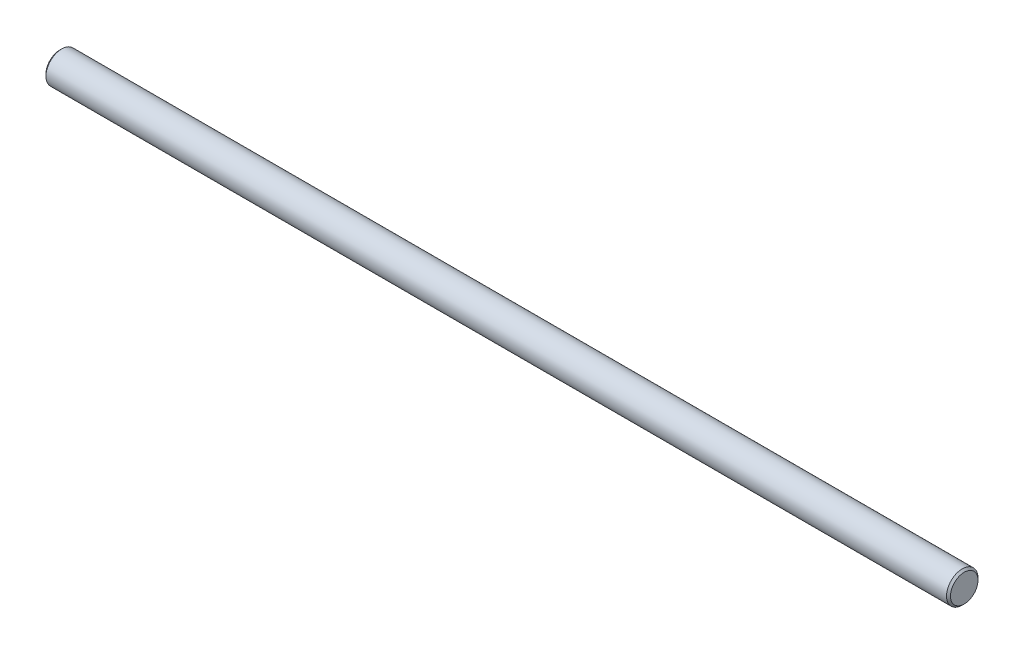
ISO-10303-21;
HEADER;
FILE_DESCRIPTION(('STEP AP214'),'2;1');
FILE_NAME('part.step','',(''),(''),'','','');
FILE_SCHEMA(('AUTOMOTIVE_DESIGN { 1 0 10303 214 1 1 1 1 }'));
ENDSEC;
DATA;
#1=APPLICATION_CONTEXT('core data for automotive mechanical design processes');
#2=APPLICATION_PROTOCOL_DEFINITION('international standard','automotive_design',2000,#1);
#3=PRODUCT_CONTEXT('',#1,'mechanical');
#4=PRODUCT('Part','Part','',(#3));
#5=PRODUCT_RELATED_PRODUCT_CATEGORY('part','',(#4));
#6=PRODUCT_DEFINITION_FORMATION('','',#4);
#7=PRODUCT_DEFINITION_CONTEXT('part definition',#1,'design');
#8=PRODUCT_DEFINITION('design','',#6,#7);
#9=PRODUCT_DEFINITION_SHAPE('','',#8);
#10=(LENGTH_UNIT() NAMED_UNIT(*) SI_UNIT(.MILLI.,.METRE.));
#11=(NAMED_UNIT(*) PLANE_ANGLE_UNIT() SI_UNIT($,.RADIAN.));
#12=(NAMED_UNIT(*) SI_UNIT($,.STERADIAN.) SOLID_ANGLE_UNIT());
#13=UNCERTAINTY_MEASURE_WITH_UNIT(LENGTH_MEASURE(1.E-05),#10,'distance_accuracy_value','');
#14=(GEOMETRIC_REPRESENTATION_CONTEXT(3) GLOBAL_UNCERTAINTY_ASSIGNED_CONTEXT((#13)) GLOBAL_UNIT_ASSIGNED_CONTEXT((#10,
#11,#12)) REPRESENTATION_CONTEXT('',''));
#15=CARTESIAN_POINT('',(0.,0.,0.));
#16=DIRECTION('',(0.,0.,1.));
#17=DIRECTION('',(1.,0.,0.));
#18=AXIS2_PLACEMENT_3D('',#15,#16,#17);
#19=CARTESIAN_POINT('',(115.,0.,0.));
#20=DIRECTION('',(-1.,0.,0.));
#21=DIRECTION('',(0.,0.,1.));
#22=AXIS2_PLACEMENT_3D('',#19,#20,#21);
#23=CYLINDRICAL_SURFACE('',#22,4.);
#24=CARTESIAN_POINT('',(-114.5,0.,0.));
#25=DIRECTION('',(1.,0.,0.));
#26=DIRECTION('',(0.,0.,-1.));
#27=AXIS2_PLACEMENT_3D('',#24,#25,#26);
#28=CIRCLE('',#27,4.);
#29=CARTESIAN_POINT('',(-114.5,0.,-4.));
#30=VERTEX_POINT('',#29);
#31=EDGE_CURVE('E53',#30,#30,#28,.T.);
#32=ORIENTED_EDGE('',*,*,#31,.T.);
#33=EDGE_LOOP('',(#32));
#34=FACE_BOUND('',#33,.T.);
#35=CARTESIAN_POINT('',(114.5,0.,0.));
#36=DIRECTION('',(1.,0.,0.));
#37=DIRECTION('',(0.,0.,-1.));
#38=AXIS2_PLACEMENT_3D('',#35,#36,#37);
#39=CIRCLE('',#38,4.);
#40=CARTESIAN_POINT('',(114.5,0.,-4.));
#41=VERTEX_POINT('',#40);
#42=EDGE_CURVE('E58',#41,#41,#39,.F.);
#43=ORIENTED_EDGE('',*,*,#42,.T.);
#44=EDGE_LOOP('',(#43));
#45=FACE_BOUND('',#44,.T.);
#46=ADVANCED_FACE('F39',(#34,#45),#23,.T.);
#47=CARTESIAN_POINT('',(115.,0.,0.));
#48=DIRECTION('',(1.,0.,0.));
#49=DIRECTION('',(0.,0.,-1.));
#50=AXIS2_PLACEMENT_3D('',#47,#48,#49);
#51=PLANE('',#50);
#52=CARTESIAN_POINT('',(115.,0.,0.));
#53=DIRECTION('',(1.,0.,0.));
#54=DIRECTION('',(0.,0.,-1.));
#55=AXIS2_PLACEMENT_3D('',#52,#53,#54);
#56=CIRCLE('',#55,3.5);
#57=CARTESIAN_POINT('',(115.,0.,-3.5));
#58=VERTEX_POINT('',#57);
#59=EDGE_CURVE('E10',#58,#58,#56,.T.);
#60=ORIENTED_EDGE('',*,*,#59,.T.);
#61=EDGE_LOOP('',(#60));
#62=FACE_BOUND('',#61,.T.);
#63=ADVANCED_FACE('F75',(#62),#51,.T.);
#64=CARTESIAN_POINT('',(-115.,0.,0.));
#65=DIRECTION('',(1.,0.,0.));
#66=DIRECTION('',(0.,0.,-1.));
#67=AXIS2_PLACEMENT_3D('',#64,#65,#66);
#68=PLANE('',#67);
#69=CARTESIAN_POINT('',(-115.,0.,0.));
#70=DIRECTION('',(1.,0.,0.));
#71=DIRECTION('',(0.,0.,-1.));
#72=AXIS2_PLACEMENT_3D('',#69,#70,#71);
#73=CIRCLE('',#72,3.50000000000003);
#74=CARTESIAN_POINT('',(-115.,0.,-3.50000000000003));
#75=VERTEX_POINT('',#74);
#76=EDGE_CURVE('E48',#75,#75,#73,.F.);
#77=ORIENTED_EDGE('',*,*,#76,.T.);
#78=EDGE_LOOP('',(#77));
#79=FACE_BOUND('',#78,.T.);
#80=ADVANCED_FACE('F72',(#79),#68,.F.);
#81=CARTESIAN_POINT('',(-114.5,0.,0.));
#82=DIRECTION('',(1.,0.,0.));
#83=DIRECTION('',(0.,0.,-1.));
#84=AXIS2_PLACEMENT_3D('',#81,#82,#83);
#85=CONICAL_SURFACE('',#84,4.,0.785398163397445);
#86=ORIENTED_EDGE('',*,*,#76,.F.);
#87=EDGE_LOOP('',(#86));
#88=FACE_BOUND('',#87,.T.);
#89=ORIENTED_EDGE('',*,*,#31,.F.);
#90=EDGE_LOOP('',(#89));
#91=FACE_BOUND('',#90,.T.);
#92=ADVANCED_FACE('F68',(#88,#91),#85,.T.);
#93=CARTESIAN_POINT('',(115.,0.,0.));
#94=DIRECTION('',(-1.,0.,0.));
#95=DIRECTION('',(0.,0.,1.));
#96=AXIS2_PLACEMENT_3D('',#93,#94,#95);
#97=CONICAL_SURFACE('',#96,3.5,0.785398163397431);
#98=ORIENTED_EDGE('',*,*,#42,.F.);
#99=EDGE_LOOP('',(#98));
#100=FACE_BOUND('',#99,.T.);
#101=ORIENTED_EDGE('',*,*,#59,.F.);
#102=EDGE_LOOP('',(#101));
#103=FACE_BOUND('',#102,.T.);
#104=ADVANCED_FACE('F42',(#100,#103),#97,.T.);
#105=CLOSED_SHELL('',(#46,#63,#80,#92,#104));
#106=MANIFOLD_SOLID_BREP('B2',#105);
#107=ADVANCED_BREP_SHAPE_REPRESENTATION('',(#18,#106),#14);
#108=SHAPE_DEFINITION_REPRESENTATION(#9,#107);
ENDSEC;
END-ISO-10303-21;
